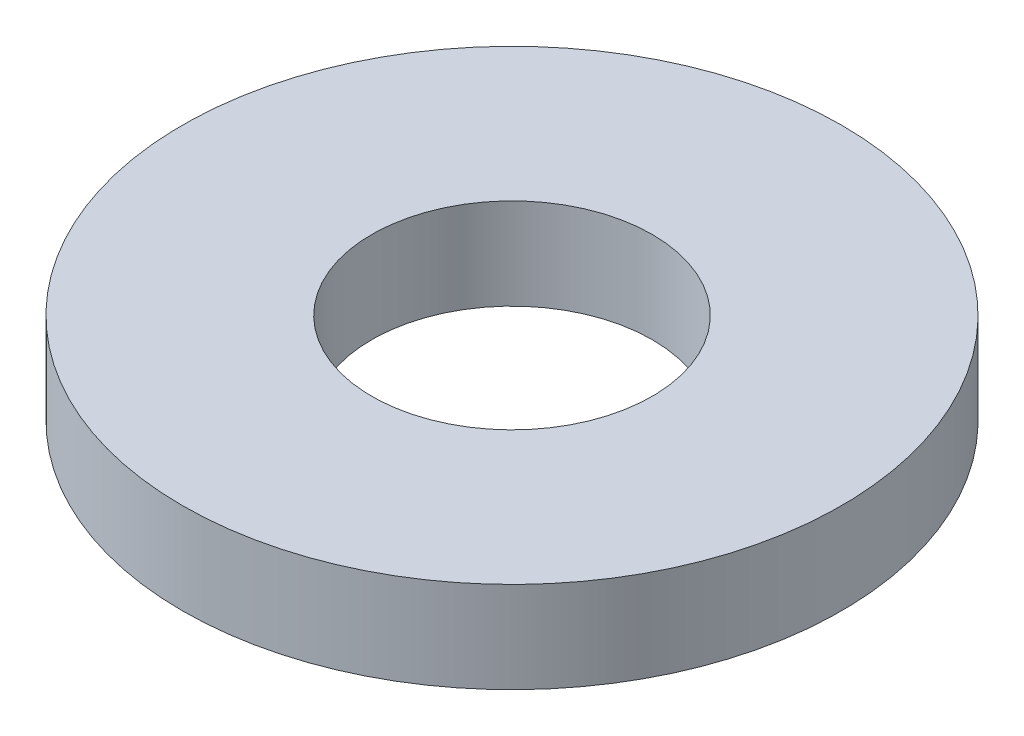
ISO-10303-21;
HEADER;
FILE_DESCRIPTION(('STEP AP214'),'2;1');
FILE_NAME('part.step','',(''),(''),'','','');
FILE_SCHEMA(('AUTOMOTIVE_DESIGN { 1 0 10303 214 1 1 1 1 }'));
ENDSEC;
DATA;
#1=APPLICATION_CONTEXT('core data for automotive mechanical design processes');
#2=APPLICATION_PROTOCOL_DEFINITION('international standard','automotive_design',2000,#1);
#3=PRODUCT_CONTEXT('',#1,'mechanical');
#4=PRODUCT('Part','Part','',(#3));
#5=PRODUCT_RELATED_PRODUCT_CATEGORY('part','',(#4));
#6=PRODUCT_DEFINITION_FORMATION('','',#4);
#7=PRODUCT_DEFINITION_CONTEXT('part definition',#1,'design');
#8=PRODUCT_DEFINITION('design','',#6,#7);
#9=PRODUCT_DEFINITION_SHAPE('','',#8);
#10=(LENGTH_UNIT() NAMED_UNIT(*) SI_UNIT(.MILLI.,.METRE.));
#11=(NAMED_UNIT(*) PLANE_ANGLE_UNIT() SI_UNIT($,.RADIAN.));
#12=(NAMED_UNIT(*) SI_UNIT($,.STERADIAN.) SOLID_ANGLE_UNIT());
#13=UNCERTAINTY_MEASURE_WITH_UNIT(LENGTH_MEASURE(1.E-05),#10,'distance_accuracy_value','');
#14=(GEOMETRIC_REPRESENTATION_CONTEXT(3) GLOBAL_UNCERTAINTY_ASSIGNED_CONTEXT((#13)) GLOBAL_UNIT_ASSIGNED_CONTEXT((#10,
#11,#12)) REPRESENTATION_CONTEXT('',''));
#15=CARTESIAN_POINT('',(0.,0.,0.));
#16=DIRECTION('',(0.,0.,1.));
#17=DIRECTION('',(1.,0.,0.));
#18=AXIS2_PLACEMENT_3D('',#15,#16,#17);
#19=CARTESIAN_POINT('',(0.,6.5,0.));
#20=DIRECTION('',(0.,1.,0.));
#21=DIRECTION('',(0.,0.,1.));
#22=AXIS2_PLACEMENT_3D('',#19,#20,#21);
#23=PLANE('',#22);
#24=CARTESIAN_POINT('',(0.,6.5,0.));
#25=DIRECTION('',(0.,1.,0.));
#26=DIRECTION('',(0.,0.,1.));
#27=AXIS2_PLACEMENT_3D('',#24,#25,#26);
#28=CIRCLE('',#27,23.5);
#29=CARTESIAN_POINT('',(0.,6.5,-23.5));
#30=VERTEX_POINT('',#29);
#31=EDGE_CURVE('E10',#30,#30,#28,.T.);
#32=ORIENTED_EDGE('',*,*,#31,.T.);
#33=EDGE_LOOP('',(#32));
#34=FACE_BOUND('',#33,.T.);
#35=CARTESIAN_POINT('',(0.,6.5,0.));
#36=DIRECTION('',(0.,1.,0.));
#37=DIRECTION('',(0.,0.,1.));
#38=AXIS2_PLACEMENT_3D('',#35,#36,#37);
#39=CIRCLE('',#38,10.);
#40=CARTESIAN_POINT('',(0.,6.5,-10.));
#41=VERTEX_POINT('',#40);
#42=EDGE_CURVE('E46',#41,#41,#39,.T.);
#43=ORIENTED_EDGE('',*,*,#42,.F.);
#44=EDGE_LOOP('',(#43));
#45=FACE_BOUND('',#44,.T.);
#46=ADVANCED_FACE('F35',(#34,#45),#23,.T.);
#47=CARTESIAN_POINT('',(0.,0.,0.));
#48=DIRECTION('',(0.,1.,0.));
#49=DIRECTION('',(0.,0.,1.));
#50=AXIS2_PLACEMENT_3D('',#47,#48,#49);
#51=PLANE('',#50);
#52=CARTESIAN_POINT('',(0.,0.,0.));
#53=DIRECTION('',(0.,1.,0.));
#54=DIRECTION('',(0.,0.,1.));
#55=AXIS2_PLACEMENT_3D('',#52,#53,#54);
#56=CIRCLE('',#55,23.5);
#57=CARTESIAN_POINT('',(0.,0.,-23.5));
#58=VERTEX_POINT('',#57);
#59=EDGE_CURVE('E39',#58,#58,#56,.T.);
#60=ORIENTED_EDGE('',*,*,#59,.F.);
#61=EDGE_LOOP('',(#60));
#62=FACE_BOUND('',#61,.T.);
#63=CARTESIAN_POINT('',(0.,0.,0.));
#64=DIRECTION('',(0.,1.,0.));
#65=DIRECTION('',(0.,0.,1.));
#66=AXIS2_PLACEMENT_3D('',#63,#64,#65);
#67=CIRCLE('',#66,10.);
#68=CARTESIAN_POINT('',(0.,0.,-10.));
#69=VERTEX_POINT('',#68);
#70=EDGE_CURVE('E48',#69,#69,#67,.T.);
#71=ORIENTED_EDGE('',*,*,#70,.T.);
#72=EDGE_LOOP('',(#71));
#73=FACE_BOUND('',#72,.T.);
#74=ADVANCED_FACE('F58',(#62,#73),#51,.F.);
#75=CARTESIAN_POINT('',(0.,6.5,0.));
#76=DIRECTION('',(0.,-1.,0.));
#77=DIRECTION('',(0.,0.,-1.));
#78=AXIS2_PLACEMENT_3D('',#75,#76,#77);
#79=CYLINDRICAL_SURFACE('',#78,23.5);
#80=CARTESIAN_POINT('',(0.,6.5,-23.5));
#81=CARTESIAN_POINT('',(0.,6.43229166666667,-23.5));
#82=CARTESIAN_POINT('',(0.,6.36458333333333,-23.5));
#83=CARTESIAN_POINT('',(0.,6.22916666666667,-23.5));
#84=CARTESIAN_POINT('',(0.,6.16145833333333,-23.5));
#85=CARTESIAN_POINT('',(0.,6.02604166666667,-23.5));
#86=CARTESIAN_POINT('',(0.,5.95833333333333,-23.5));
#87=CARTESIAN_POINT('',(0.,5.82291666666667,-23.5));
#88=CARTESIAN_POINT('',(0.,5.75520833333333,-23.5));
#89=CARTESIAN_POINT('',(0.,5.61979166666667,-23.5));
#90=CARTESIAN_POINT('',(0.,5.55208333333333,-23.5));
#91=CARTESIAN_POINT('',(0.,5.41666666666667,-23.5));
#92=CARTESIAN_POINT('',(0.,5.34895833333333,-23.5));
#93=CARTESIAN_POINT('',(0.,5.21354166666667,-23.5));
#94=CARTESIAN_POINT('',(0.,5.14583333333333,-23.5));
#95=CARTESIAN_POINT('',(0.,5.01041666666667,-23.5));
#96=CARTESIAN_POINT('',(0.,4.94270833333333,-23.5));
#97=CARTESIAN_POINT('',(0.,4.80729166666667,-23.5));
#98=CARTESIAN_POINT('',(0.,4.73958333333333,-23.5));
#99=CARTESIAN_POINT('',(0.,4.60416666666667,-23.5));
#100=CARTESIAN_POINT('',(0.,4.53645833333333,-23.5));
#101=CARTESIAN_POINT('',(0.,4.40104166666667,-23.5));
#102=CARTESIAN_POINT('',(0.,4.33333333333333,-23.5));
#103=CARTESIAN_POINT('',(0.,4.19791666666667,-23.5));
#104=CARTESIAN_POINT('',(0.,4.13020833333333,-23.5));
#105=CARTESIAN_POINT('',(0.,3.99479166666667,-23.5));
#106=CARTESIAN_POINT('',(0.,3.92708333333333,-23.5));
#107=CARTESIAN_POINT('',(0.,3.79166666666667,-23.5));
#108=CARTESIAN_POINT('',(0.,3.72395833333333,-23.5));
#109=CARTESIAN_POINT('',(0.,3.58854166666667,-23.5));
#110=CARTESIAN_POINT('',(0.,3.52083333333333,-23.5));
#111=CARTESIAN_POINT('',(0.,3.38541666666667,-23.5));
#112=CARTESIAN_POINT('',(0.,3.31770833333333,-23.5));
#113=CARTESIAN_POINT('',(0.,3.18229166666667,-23.5));
#114=CARTESIAN_POINT('',(0.,3.11458333333333,-23.5));
#115=CARTESIAN_POINT('',(0.,2.97916666666667,-23.5));
#116=CARTESIAN_POINT('',(0.,2.91145833333333,-23.5));
#117=CARTESIAN_POINT('',(0.,2.77604166666667,-23.5));
#118=CARTESIAN_POINT('',(0.,2.70833333333333,-23.5));
#119=CARTESIAN_POINT('',(0.,2.57291666666667,-23.5));
#120=CARTESIAN_POINT('',(0.,2.50520833333333,-23.5));
#121=CARTESIAN_POINT('',(0.,2.36979166666667,-23.5));
#122=CARTESIAN_POINT('',(0.,2.30208333333333,-23.5));
#123=CARTESIAN_POINT('',(0.,2.16666666666667,-23.5));
#124=CARTESIAN_POINT('',(0.,2.09895833333333,-23.5));
#125=CARTESIAN_POINT('',(0.,1.96354166666667,-23.5));
#126=CARTESIAN_POINT('',(0.,1.89583333333333,-23.5));
#127=CARTESIAN_POINT('',(0.,1.76041666666667,-23.5));
#128=CARTESIAN_POINT('',(0.,1.69270833333333,-23.5));
#129=CARTESIAN_POINT('',(0.,1.55729166666667,-23.5));
#130=CARTESIAN_POINT('',(0.,1.48958333333333,-23.5));
#131=CARTESIAN_POINT('',(0.,1.35416666666667,-23.5));
#132=CARTESIAN_POINT('',(0.,1.28645833333333,-23.5));
#133=CARTESIAN_POINT('',(0.,1.15104166666667,-23.5));
#134=CARTESIAN_POINT('',(0.,1.08333333333333,-23.5));
#135=CARTESIAN_POINT('',(0.,0.947916666666667,-23.5));
#136=CARTESIAN_POINT('',(0.,0.880208333333333,-23.5));
#137=CARTESIAN_POINT('',(0.,0.744791666666667,-23.5));
#138=CARTESIAN_POINT('',(0.,0.677083333333333,-23.5));
#139=CARTESIAN_POINT('',(0.,0.541666666666667,-23.5));
#140=CARTESIAN_POINT('',(0.,0.473958333333333,-23.5));
#141=CARTESIAN_POINT('',(0.,0.338541666666667,-23.5));
#142=CARTESIAN_POINT('',(0.,0.270833333333334,-23.5));
#143=CARTESIAN_POINT('',(0.,0.135416666666667,-23.5));
#144=CARTESIAN_POINT('',(0.,0.0677083333333334,-23.5));
#145=CARTESIAN_POINT('',(0.,0.,-23.5));
#146=B_SPLINE_CURVE_WITH_KNOTS('',3,(#80,#81,#82,#83,#84,#85,#86,#87,#88,#89,#90,#91,#92,#93,
#94,#95,#96,#97,#98,#99,#100,#101,#102,#103,#104,#105,#106,#107,#108,#109,#110,#111,#112,#113,
#114,#115,#116,#117,#118,#119,#120,#121,#122,#123,#124,#125,#126,#127,#128,#129,#130,#131,#132,
#133,#134,#135,#136,#137,#138,#139,#140,#141,#142,#143,#144,#145),.UNSPECIFIED.,.F.,.F.,(4,2,2,
2,2,2,2,2,2,2,2,2,2,2,2,2,2,2,2,2,2,2,2,2,2,2,2,2,2,2,2,2,4),(0.,0.203124999999999,0.40625,
0.609375,0.812499999999999,1.015625,1.21875,1.421875,1.625,1.828125,2.03125,2.234375,2.4375,
2.640625,2.84375,3.046875,3.25,3.453125,3.65625,3.859375,4.0625,4.265625,4.46875,4.671875,4.875,
5.078125,5.28125,5.484375,5.6875,5.890625,6.09375,6.296875,6.5),.UNSPECIFIED.);
#147=EDGE_CURVE('BSEAM37',#30,#58,#146,.T.);
#148=ORIENTED_EDGE('',*,*,#31,.F.);
#149=ORIENTED_EDGE('',*,*,#59,.T.);
#150=ORIENTED_EDGE('',*,*,#147,.T.);
#151=ORIENTED_EDGE('',*,*,#147,.F.);
#152=EDGE_LOOP('',(#148,#150,#149,#151));
#153=FACE_BOUND('',#152,.T.);
#154=ADVANCED_FACE('F37',(#153),#79,.T.);
#155=CARTESIAN_POINT('',(0.,6.5,0.));
#156=DIRECTION('',(0.,-1.,0.));
#157=DIRECTION('',(0.,0.,-1.));
#158=AXIS2_PLACEMENT_3D('',#155,#156,#157);
#159=CYLINDRICAL_SURFACE('',#158,10.);
#160=CARTESIAN_POINT('',(0.,6.5,-10.));
#161=CARTESIAN_POINT('',(0.,6.43229166666667,-10.));
#162=CARTESIAN_POINT('',(0.,6.36458333333333,-10.));
#163=CARTESIAN_POINT('',(0.,6.22916666666667,-10.));
#164=CARTESIAN_POINT('',(0.,6.16145833333333,-10.));
#165=CARTESIAN_POINT('',(0.,6.02604166666667,-10.));
#166=CARTESIAN_POINT('',(0.,5.95833333333333,-10.));
#167=CARTESIAN_POINT('',(0.,5.82291666666667,-10.));
#168=CARTESIAN_POINT('',(0.,5.75520833333333,-10.));
#169=CARTESIAN_POINT('',(0.,5.61979166666667,-10.));
#170=CARTESIAN_POINT('',(0.,5.55208333333333,-10.));
#171=CARTESIAN_POINT('',(0.,5.41666666666667,-10.));
#172=CARTESIAN_POINT('',(0.,5.34895833333333,-10.));
#173=CARTESIAN_POINT('',(0.,5.21354166666667,-10.));
#174=CARTESIAN_POINT('',(0.,5.14583333333333,-10.));
#175=CARTESIAN_POINT('',(0.,5.01041666666667,-10.));
#176=CARTESIAN_POINT('',(0.,4.94270833333333,-10.));
#177=CARTESIAN_POINT('',(0.,4.80729166666667,-10.));
#178=CARTESIAN_POINT('',(0.,4.73958333333333,-10.));
#179=CARTESIAN_POINT('',(0.,4.60416666666667,-10.));
#180=CARTESIAN_POINT('',(0.,4.53645833333333,-10.));
#181=CARTESIAN_POINT('',(0.,4.40104166666667,-10.));
#182=CARTESIAN_POINT('',(0.,4.33333333333333,-10.));
#183=CARTESIAN_POINT('',(0.,4.19791666666667,-10.));
#184=CARTESIAN_POINT('',(0.,4.13020833333333,-10.));
#185=CARTESIAN_POINT('',(0.,3.99479166666667,-10.));
#186=CARTESIAN_POINT('',(0.,3.92708333333333,-10.));
#187=CARTESIAN_POINT('',(0.,3.79166666666667,-10.));
#188=CARTESIAN_POINT('',(0.,3.72395833333333,-10.));
#189=CARTESIAN_POINT('',(0.,3.58854166666667,-10.));
#190=CARTESIAN_POINT('',(0.,3.52083333333333,-10.));
#191=CARTESIAN_POINT('',(0.,3.38541666666667,-10.));
#192=CARTESIAN_POINT('',(0.,3.31770833333333,-10.));
#193=CARTESIAN_POINT('',(0.,3.18229166666667,-10.));
#194=CARTESIAN_POINT('',(0.,3.11458333333333,-10.));
#195=CARTESIAN_POINT('',(0.,2.97916666666667,-10.));
#196=CARTESIAN_POINT('',(0.,2.91145833333333,-10.));
#197=CARTESIAN_POINT('',(0.,2.77604166666667,-10.));
#198=CARTESIAN_POINT('',(0.,2.70833333333333,-10.));
#199=CARTESIAN_POINT('',(0.,2.57291666666667,-10.));
#200=CARTESIAN_POINT('',(0.,2.50520833333333,-10.));
#201=CARTESIAN_POINT('',(0.,2.36979166666667,-10.));
#202=CARTESIAN_POINT('',(0.,2.30208333333333,-10.));
#203=CARTESIAN_POINT('',(0.,2.16666666666667,-10.));
#204=CARTESIAN_POINT('',(0.,2.09895833333333,-10.));
#205=CARTESIAN_POINT('',(0.,1.96354166666667,-10.));
#206=CARTESIAN_POINT('',(0.,1.89583333333333,-10.));
#207=CARTESIAN_POINT('',(0.,1.76041666666667,-10.));
#208=CARTESIAN_POINT('',(0.,1.69270833333333,-10.));
#209=CARTESIAN_POINT('',(0.,1.55729166666667,-10.));
#210=CARTESIAN_POINT('',(0.,1.48958333333333,-10.));
#211=CARTESIAN_POINT('',(0.,1.35416666666667,-10.));
#212=CARTESIAN_POINT('',(0.,1.28645833333333,-10.));
#213=CARTESIAN_POINT('',(0.,1.15104166666667,-10.));
#214=CARTESIAN_POINT('',(0.,1.08333333333333,-10.));
#215=CARTESIAN_POINT('',(0.,0.947916666666667,-10.));
#216=CARTESIAN_POINT('',(0.,0.880208333333333,-10.));
#217=CARTESIAN_POINT('',(0.,0.744791666666667,-10.));
#218=CARTESIAN_POINT('',(0.,0.677083333333333,-10.));
#219=CARTESIAN_POINT('',(0.,0.541666666666667,-10.));
#220=CARTESIAN_POINT('',(0.,0.473958333333333,-10.));
#221=CARTESIAN_POINT('',(0.,0.338541666666667,-10.));
#222=CARTESIAN_POINT('',(0.,0.270833333333334,-10.));
#223=CARTESIAN_POINT('',(0.,0.135416666666667,-10.));
#224=CARTESIAN_POINT('',(0.,0.0677083333333334,-10.));
#225=CARTESIAN_POINT('',(0.,0.,-10.));
#226=B_SPLINE_CURVE_WITH_KNOTS('',3,(#160,#161,#162,#163,#164,#165,#166,#167,#168,#169,#170,
#171,#172,#173,#174,#175,#176,#177,#178,#179,#180,#181,#182,#183,#184,#185,#186,#187,#188,#189,
#190,#191,#192,#193,#194,#195,#196,#197,#198,#199,#200,#201,#202,#203,#204,#205,#206,#207,#208,
#209,#210,#211,#212,#213,#214,#215,#216,#217,#218,#219,#220,#221,#222,#223,#224,#225),
.UNSPECIFIED.,.F.,.F.,(4,2,2,2,2,2,2,2,2,2,2,2,2,2,2,2,2,2,2,2,2,2,2,2,2,2,2,2,2,2,2,2,4),(0.,
0.203125,0.40625,0.609375000000001,0.812500000000001,1.015625,1.21875,1.421875,1.625,1.828125,
2.03125,2.234375,2.4375,2.640625,2.84375,3.046875,3.25,3.453125,3.65625,3.859375,4.0625,
4.265625,4.46875,4.671875,4.875,5.078125,5.28125,5.484375,5.6875,5.890625,6.09375,6.296875,6.5),.UNSPECIFIED.);
#227=EDGE_CURVE('BSEAM54',#41,#69,#226,.T.);
#228=ORIENTED_EDGE('',*,*,#42,.T.);
#229=ORIENTED_EDGE('',*,*,#70,.F.);
#230=ORIENTED_EDGE('',*,*,#227,.T.);
#231=ORIENTED_EDGE('',*,*,#227,.F.);
#232=EDGE_LOOP('',(#228,#230,#229,#231));
#233=FACE_BOUND('',#232,.T.);
#234=ADVANCED_FACE('F54',(#233),#159,.F.);
#235=CLOSED_SHELL('',(#46,#74,#154,#234));
#236=MANIFOLD_SOLID_BREP('B2',#235);
#237=ADVANCED_BREP_SHAPE_REPRESENTATION('',(#18,#236),#14);
#238=SHAPE_DEFINITION_REPRESENTATION(#9,#237);
ENDSEC;
END-ISO-10303-21;
